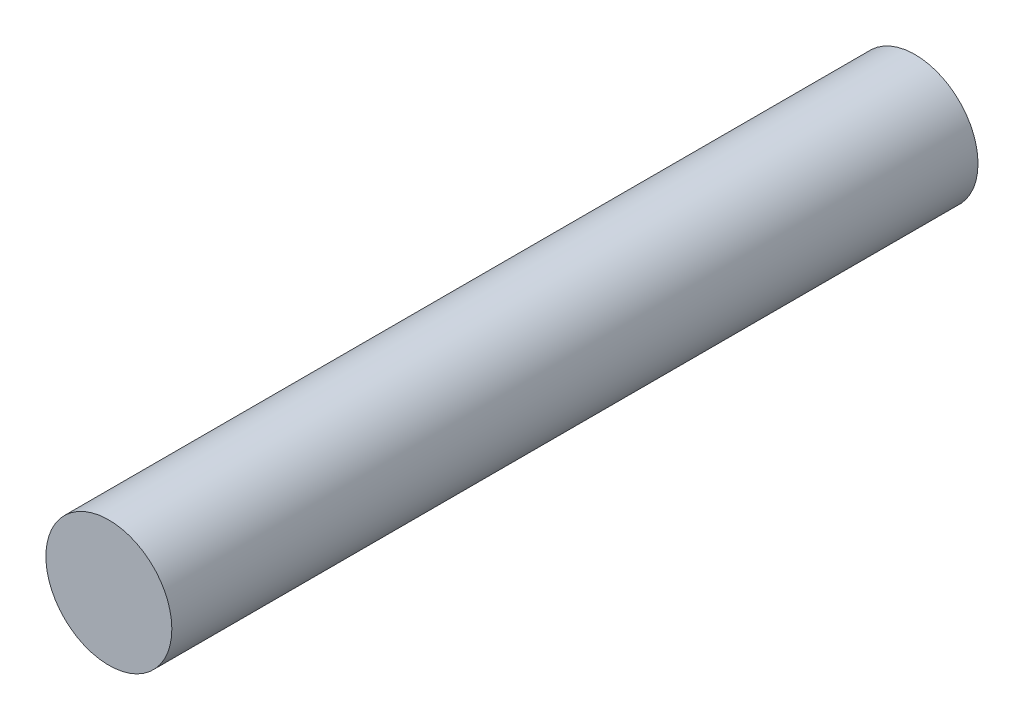
ISO-10303-21;
HEADER;
FILE_DESCRIPTION(('STEP AP214'),'2;1');
FILE_NAME('part.step','',(''),(''),'','','');
FILE_SCHEMA(('AUTOMOTIVE_DESIGN { 1 0 10303 214 1 1 1 1 }'));
ENDSEC;
DATA;
#1=APPLICATION_CONTEXT('core data for automotive mechanical design processes');
#2=APPLICATION_PROTOCOL_DEFINITION('international standard','automotive_design',2000,#1);
#3=PRODUCT_CONTEXT('',#1,'mechanical');
#4=PRODUCT('Part','Part','',(#3));
#5=PRODUCT_RELATED_PRODUCT_CATEGORY('part','',(#4));
#6=PRODUCT_DEFINITION_FORMATION('','',#4);
#7=PRODUCT_DEFINITION_CONTEXT('part definition',#1,'design');
#8=PRODUCT_DEFINITION('design','',#6,#7);
#9=PRODUCT_DEFINITION_SHAPE('','',#8);
#10=(LENGTH_UNIT() NAMED_UNIT(*) SI_UNIT(.MILLI.,.METRE.));
#11=(NAMED_UNIT(*) PLANE_ANGLE_UNIT() SI_UNIT($,.RADIAN.));
#12=(NAMED_UNIT(*) SI_UNIT($,.STERADIAN.) SOLID_ANGLE_UNIT());
#13=UNCERTAINTY_MEASURE_WITH_UNIT(LENGTH_MEASURE(1.E-05),#10,'distance_accuracy_value','');
#14=(GEOMETRIC_REPRESENTATION_CONTEXT(3) GLOBAL_UNCERTAINTY_ASSIGNED_CONTEXT((#13)) GLOBAL_UNIT_ASSIGNED_CONTEXT((#10,
#11,#12)) REPRESENTATION_CONTEXT('',''));
#15=CARTESIAN_POINT('',(0.,0.,0.));
#16=DIRECTION('',(0.,0.,1.));
#17=DIRECTION('',(1.,0.,0.));
#18=AXIS2_PLACEMENT_3D('',#15,#16,#17);
#19=CARTESIAN_POINT('',(0.,0.,-101.6));
#20=DIRECTION('',(0.,0.,1.));
#21=DIRECTION('',(1.,0.,0.));
#22=AXIS2_PLACEMENT_3D('',#19,#20,#21);
#23=CYLINDRICAL_SURFACE('',#22,15.875);
#24=CARTESIAN_POINT('',(0.,0.,-101.6));
#25=DIRECTION('',(0.,0.,1.));
#26=DIRECTION('',(1.,0.,0.));
#27=AXIS2_PLACEMENT_3D('',#24,#25,#26);
#28=CIRCLE('',#27,15.875);
#29=CARTESIAN_POINT('',(15.875,0.,-101.6));
#30=VERTEX_POINT('',#29);
#31=EDGE_CURVE('E10',#30,#30,#28,.T.);
#32=ORIENTED_EDGE('',*,*,#31,.T.);
#33=EDGE_LOOP('',(#32));
#34=FACE_BOUND('',#33,.T.);
#35=CARTESIAN_POINT('',(0.,0.,101.6));
#36=DIRECTION('',(0.,0.,1.));
#37=DIRECTION('',(1.,0.,0.));
#38=AXIS2_PLACEMENT_3D('',#35,#36,#37);
#39=CIRCLE('',#38,15.875);
#40=CARTESIAN_POINT('',(15.875,0.,101.6));
#41=VERTEX_POINT('',#40);
#42=EDGE_CURVE('E34',#41,#41,#39,.T.);
#43=ORIENTED_EDGE('',*,*,#42,.F.);
#44=EDGE_LOOP('',(#43));
#45=FACE_BOUND('',#44,.T.);
#46=ADVANCED_FACE('F31',(#34,#45),#23,.T.);
#47=CARTESIAN_POINT('',(0.,0.,-101.6));
#48=DIRECTION('',(0.,0.,1.));
#49=DIRECTION('',(1.,0.,0.));
#50=AXIS2_PLACEMENT_3D('',#47,#48,#49);
#51=PLANE('',#50);
#52=ORIENTED_EDGE('',*,*,#31,.F.);
#53=EDGE_LOOP('',(#52));
#54=FACE_BOUND('',#53,.T.);
#55=ADVANCED_FACE('F46',(#54),#51,.F.);
#56=CARTESIAN_POINT('',(0.,0.,101.6));
#57=DIRECTION('',(0.,0.,1.));
#58=DIRECTION('',(1.,0.,0.));
#59=AXIS2_PLACEMENT_3D('',#56,#57,#58);
#60=PLANE('',#59);
#61=ORIENTED_EDGE('',*,*,#42,.T.);
#62=EDGE_LOOP('',(#61));
#63=FACE_BOUND('',#62,.T.);
#64=ADVANCED_FACE('F43',(#63),#60,.T.);
#65=CLOSED_SHELL('',(#46,#55,#64));
#66=MANIFOLD_SOLID_BREP('B2',#65);
#67=ADVANCED_BREP_SHAPE_REPRESENTATION('',(#18,#66),#14);
#68=SHAPE_DEFINITION_REPRESENTATION(#9,#67);
ENDSEC;
END-ISO-10303-21;
